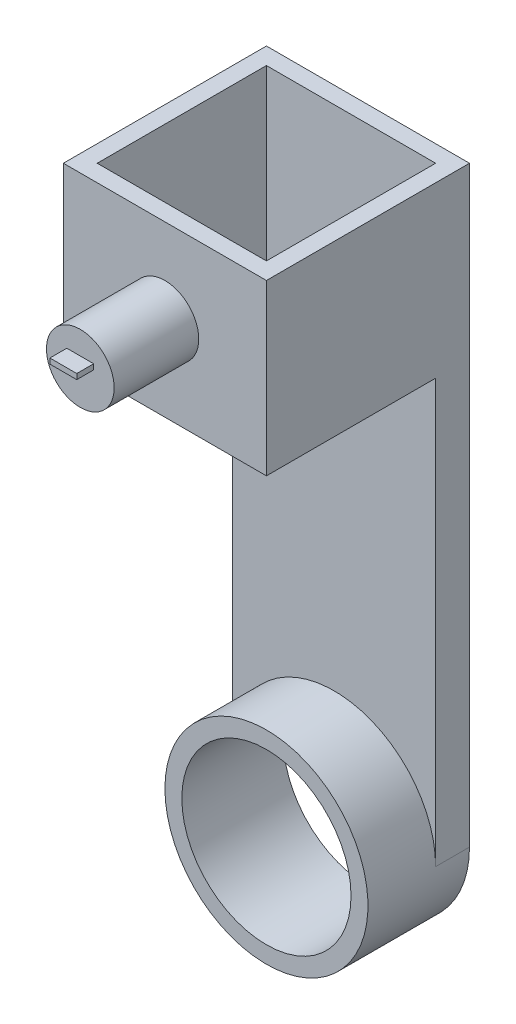
ISO-10303-21;
HEADER;
FILE_DESCRIPTION(('STEP AP214'),'2;1');
FILE_NAME('part.step','',(''),(''),'','','');
FILE_SCHEMA(('AUTOMOTIVE_DESIGN { 1 0 10303 214 1 1 1 1 }'));
ENDSEC;
DATA;
#1=APPLICATION_CONTEXT('core data for automotive mechanical design processes');
#2=APPLICATION_PROTOCOL_DEFINITION('international standard','automotive_design',2000,#1);
#3=PRODUCT_CONTEXT('',#1,'mechanical');
#4=PRODUCT('Part','Part','',(#3));
#5=PRODUCT_RELATED_PRODUCT_CATEGORY('part','',(#4));
#6=PRODUCT_DEFINITION_FORMATION('','',#4);
#7=PRODUCT_DEFINITION_CONTEXT('part definition',#1,'design');
#8=PRODUCT_DEFINITION('design','',#6,#7);
#9=PRODUCT_DEFINITION_SHAPE('','',#8);
#10=(LENGTH_UNIT() NAMED_UNIT(*) SI_UNIT(.MILLI.,.METRE.));
#11=(NAMED_UNIT(*) PLANE_ANGLE_UNIT() SI_UNIT($,.RADIAN.));
#12=(NAMED_UNIT(*) SI_UNIT($,.STERADIAN.) SOLID_ANGLE_UNIT());
#13=UNCERTAINTY_MEASURE_WITH_UNIT(LENGTH_MEASURE(1.E-05),#10,'distance_accuracy_value','');
#14=(GEOMETRIC_REPRESENTATION_CONTEXT(3) GLOBAL_UNCERTAINTY_ASSIGNED_CONTEXT((#13)) GLOBAL_UNIT_ASSIGNED_CONTEXT((#10,
#11,#12)) REPRESENTATION_CONTEXT('',''));
#15=CARTESIAN_POINT('',(0.,0.,0.));
#16=DIRECTION('',(0.,0.,1.));
#17=DIRECTION('',(1.,0.,0.));
#18=AXIS2_PLACEMENT_3D('',#15,#16,#17);
#19=CARTESIAN_POINT('',(0.,0.,17.));
#20=DIRECTION('',(0.,0.,1.));
#21=DIRECTION('',(1.,0.,0.));
#22=AXIS2_PLACEMENT_3D('',#19,#20,#21);
#23=PLANE('',#22);
#24=CARTESIAN_POINT('',(0.,30.,17.));
#25=DIRECTION('',(0.,0.,1.));
#26=DIRECTION('',(1.,0.,0.));
#27=AXIS2_PLACEMENT_3D('',#24,#25,#26);
#28=CIRCLE('',#27,2.);
#29=CARTESIAN_POINT('',(2.,30.,17.));
#30=VERTEX_POINT('',#29);
#31=EDGE_CURVE('E175',#30,#30,#28,.T.);
#32=ORIENTED_EDGE('',*,*,#31,.T.);
#33=EDGE_LOOP('',(#32));
#34=FACE_BOUND('',#33,.T.);
#35=DIRECTION('',(1.,0.,0.));
#36=VECTOR('',#35,1.);
#37=CARTESIAN_POINT('',(-0.797202197602834,30.3196897595803,17.));
#38=LINE('',#37,#36);
#39=CARTESIAN_POINT('',(-0.797202197602834,30.3196897595803,17.));
#40=VERTEX_POINT('',#39);
#41=CARTESIAN_POINT('',(0.791315647143659,30.3196897595803,17.));
#42=VERTEX_POINT('',#41);
#43=EDGE_CURVE('E464',#40,#42,#38,.T.);
#44=ORIENTED_EDGE('',*,*,#43,.F.);
#45=DIRECTION('',(0.,-1.,0.));
#46=VECTOR('',#45,1.);
#47=CARTESIAN_POINT('',(-0.797202197602834,30.6335435420232,17.));
#48=LINE('',#47,#46);
#49=CARTESIAN_POINT('',(-0.797202197602834,30.6335435420232,17.));
#50=VERTEX_POINT('',#49);
#51=EDGE_CURVE('E173',#50,#40,#48,.T.);
#52=ORIENTED_EDGE('',*,*,#51,.F.);
#53=DIRECTION('',(-1.,0.,0.));
#54=VECTOR('',#53,1.);
#55=CARTESIAN_POINT('',(-0.797202197602834,30.6335435420232,17.));
#56=LINE('',#55,#54);
#57=CARTESIAN_POINT('',(0.791315647143659,30.6335435420232,17.));
#58=VERTEX_POINT('',#57);
#59=EDGE_CURVE('E169',#58,#50,#56,.T.);
#60=ORIENTED_EDGE('',*,*,#59,.F.);
#61=DIRECTION('',(0.,1.,0.));
#62=VECTOR('',#61,1.);
#63=CARTESIAN_POINT('',(0.791315647143659,30.3196897595803,17.));
#64=LINE('',#63,#62);
#65=EDGE_CURVE('E461',#42,#58,#64,.T.);
#66=ORIENTED_EDGE('',*,*,#65,.F.);
#67=EDGE_LOOP('',(#44,#52,#60,#66));
#68=FACE_BOUND('',#67,.T.);
#69=ADVANCED_FACE('F41',(#34,#68),#23,.T.);
#70=CARTESIAN_POINT('',(0.,35.,0.));
#71=DIRECTION('',(0.,1.,0.));
#72=DIRECTION('',(0.,0.,1.));
#73=AXIS2_PLACEMENT_3D('',#70,#71,#72);
#74=PLANE('',#73);
#75=DIRECTION('',(0.,0.,1.));
#76=VECTOR('',#75,1.);
#77=CARTESIAN_POINT('',(-6.,35.,0.));
#78=LINE('',#77,#76);
#79=CARTESIAN_POINT('',(-6.,35.,0.));
#80=VERTEX_POINT('',#79);
#81=CARTESIAN_POINT('',(-6.,35.,12.));
#82=VERTEX_POINT('',#81);
#83=EDGE_CURVE('E215',#80,#82,#78,.T.);
#84=ORIENTED_EDGE('',*,*,#83,.T.);
#85=DIRECTION('',(1.,0.,0.));
#86=VECTOR('',#85,1.);
#87=CARTESIAN_POINT('',(-6.,35.,12.));
#88=LINE('',#87,#86);
#89=CARTESIAN_POINT('',(6.,35.,12.));
#90=VERTEX_POINT('',#89);
#91=EDGE_CURVE('E218',#82,#90,#88,.T.);
#92=ORIENTED_EDGE('',*,*,#91,.T.);
#93=DIRECTION('',(0.,0.,-1.));
#94=VECTOR('',#93,1.);
#95=CARTESIAN_POINT('',(6.,35.,0.));
#96=LINE('',#95,#94);
#97=CARTESIAN_POINT('',(6.,35.,0.));
#98=VERTEX_POINT('',#97);
#99=EDGE_CURVE('E221',#90,#98,#96,.T.);
#100=ORIENTED_EDGE('',*,*,#99,.T.);
#101=DIRECTION('',(-1.,0.,0.));
#102=VECTOR('',#101,1.);
#103=CARTESIAN_POINT('',(-6.,35.,0.));
#104=LINE('',#103,#102);
#105=EDGE_CURVE('E224',#98,#80,#104,.T.);
#106=ORIENTED_EDGE('',*,*,#105,.T.);
#107=EDGE_LOOP('',(#84,#92,#100,#106));
#108=FACE_BOUND('',#107,.T.);
#109=DIRECTION('',(0.,0.,-1.));
#110=VECTOR('',#109,1.);
#111=CARTESIAN_POINT('',(-5.00000000000002,35.,0.));
#112=LINE('',#111,#110);
#113=CARTESIAN_POINT('',(-5.00000000000002,35.,11.));
#114=VERTEX_POINT('',#113);
#115=CARTESIAN_POINT('',(-5.00000000000002,35.,0.999999999999982));
#116=VERTEX_POINT('',#115);
#117=EDGE_CURVE('E199',#114,#116,#112,.T.);
#118=ORIENTED_EDGE('',*,*,#117,.T.);
#119=DIRECTION('',(1.,0.,0.));
#120=VECTOR('',#119,1.);
#121=CARTESIAN_POINT('',(0.,35.,0.999999999999999));
#122=LINE('',#121,#120);
#123=CARTESIAN_POINT('',(5.00000000000002,35.,0.999999999999999));
#124=VERTEX_POINT('',#123);
#125=EDGE_CURVE('E65',#116,#124,#122,.T.);
#126=ORIENTED_EDGE('',*,*,#125,.T.);
#127=DIRECTION('',(0.,0.,-1.));
#128=VECTOR('',#127,1.);
#129=CARTESIAN_POINT('',(5.00000000000002,35.,0.));
#130=LINE('',#129,#128);
#131=CARTESIAN_POINT('',(5.,35.,11.));
#132=VERTEX_POINT('',#131);
#133=EDGE_CURVE('E186',#132,#124,#130,.T.);
#134=ORIENTED_EDGE('',*,*,#133,.F.);
#135=DIRECTION('',(1.,0.,0.));
#136=VECTOR('',#135,1.);
#137=CARTESIAN_POINT('',(0.,35.,11.));
#138=LINE('',#137,#136);
#139=EDGE_CURVE('E202',#114,#132,#138,.T.);
#140=ORIENTED_EDGE('',*,*,#139,.F.);
#141=EDGE_LOOP('',(#118,#126,#134,#140));
#142=FACE_BOUND('',#141,.T.);
#143=ADVANCED_FACE('F282',(#108,#142),#74,.T.);
#144=CARTESIAN_POINT('',(6.,0.,2.));
#145=DIRECTION('',(-1.,0.,0.));
#146=DIRECTION('',(0.,-1.,0.));
#147=AXIS2_PLACEMENT_3D('',#144,#145,#146);
#148=PLANE('',#147);
#149=DIRECTION('',(0.,1.,0.));
#150=VECTOR('',#149,1.);
#151=CARTESIAN_POINT('',(6.,0.,0.));
#152=LINE('',#151,#150);
#153=CARTESIAN_POINT('',(6.,0.,0.));
#154=VERTEX_POINT('',#153);
#155=EDGE_CURVE('E248',#154,#98,#152,.T.);
#156=ORIENTED_EDGE('',*,*,#155,.T.);
#157=ORIENTED_EDGE('',*,*,#99,.F.);
#158=DIRECTION('',(0.,-1.,0.));
#159=VECTOR('',#158,1.);
#160=CARTESIAN_POINT('',(6.,35.,12.));
#161=LINE('',#160,#159);
#162=CARTESIAN_POINT('',(6.,25.,12.));
#163=VERTEX_POINT('',#162);
#164=EDGE_CURVE('E227',#90,#163,#161,.T.);
#165=ORIENTED_EDGE('',*,*,#164,.T.);
#166=DIRECTION('',(0.,0.,-1.));
#167=VECTOR('',#166,1.);
#168=CARTESIAN_POINT('',(6.,25.,0.));
#169=LINE('',#168,#167);
#170=CARTESIAN_POINT('',(6.,25.,2.));
#171=VERTEX_POINT('',#170);
#172=EDGE_CURVE('E219',#163,#171,#169,.T.);
#173=ORIENTED_EDGE('',*,*,#172,.T.);
#174=DIRECTION('',(0.,1.,0.));
#175=VECTOR('',#174,1.);
#176=CARTESIAN_POINT('',(6.,0.,2.));
#177=LINE('',#176,#175);
#178=CARTESIAN_POINT('',(6.,0.,2.));
#179=VERTEX_POINT('',#178);
#180=EDGE_CURVE('E252',#179,#171,#177,.T.);
#181=ORIENTED_EDGE('',*,*,#180,.F.);
#182=DIRECTION('',(0.,0.,-1.));
#183=VECTOR('',#182,1.);
#184=CARTESIAN_POINT('',(6.,0.,2.));
#185=LINE('',#184,#183);
#186=EDGE_CURVE('E45',#179,#154,#185,.T.);
#187=ORIENTED_EDGE('',*,*,#186,.T.);
#188=EDGE_LOOP('',(#156,#157,#165,#173,#181,#187));
#189=FACE_BOUND('',#188,.T.);
#190=ADVANCED_FACE('F43',(#189),#148,.F.);
#191=CARTESIAN_POINT('',(-6.,0.,2.));
#192=DIRECTION('',(1.,0.,0.));
#193=DIRECTION('',(0.,1.,0.));
#194=AXIS2_PLACEMENT_3D('',#191,#192,#193);
#195=PLANE('',#194);
#196=DIRECTION('',(0.,-1.,0.));
#197=VECTOR('',#196,1.);
#198=CARTESIAN_POINT('',(-6.,0.,0.));
#199=LINE('',#198,#197);
#200=CARTESIAN_POINT('',(-6.,0.,0.));
#201=VERTEX_POINT('',#200);
#202=EDGE_CURVE('E253',#80,#201,#199,.T.);
#203=ORIENTED_EDGE('',*,*,#202,.T.);
#204=DIRECTION('',(0.,0.,-1.));
#205=VECTOR('',#204,1.);
#206=CARTESIAN_POINT('',(-6.,0.,2.));
#207=LINE('',#206,#205);
#208=CARTESIAN_POINT('',(-6.,0.,2.));
#209=VERTEX_POINT('',#208);
#210=EDGE_CURVE('E264',#209,#201,#207,.T.);
#211=ORIENTED_EDGE('',*,*,#210,.F.);
#212=DIRECTION('',(0.,-1.,0.));
#213=VECTOR('',#212,1.);
#214=CARTESIAN_POINT('',(-6.,0.,2.));
#215=LINE('',#214,#213);
#216=CARTESIAN_POINT('',(-6.,25.,2.));
#217=VERTEX_POINT('',#216);
#218=EDGE_CURVE('E260',#217,#209,#215,.T.);
#219=ORIENTED_EDGE('',*,*,#218,.F.);
#220=DIRECTION('',(0.,0.,1.));
#221=VECTOR('',#220,1.);
#222=CARTESIAN_POINT('',(-6.,25.,0.));
#223=LINE('',#222,#221);
#224=CARTESIAN_POINT('',(-6.,25.,12.));
#225=VERTEX_POINT('',#224);
#226=EDGE_CURVE('E209',#217,#225,#223,.T.);
#227=ORIENTED_EDGE('',*,*,#226,.T.);
#228=DIRECTION('',(0.,-1.,0.));
#229=VECTOR('',#228,1.);
#230=CARTESIAN_POINT('',(-6.,35.,12.));
#231=LINE('',#230,#229);
#232=EDGE_CURVE('E235',#82,#225,#231,.T.);
#233=ORIENTED_EDGE('',*,*,#232,.F.);
#234=ORIENTED_EDGE('',*,*,#83,.F.);
#235=EDGE_LOOP('',(#203,#211,#219,#227,#233,#234));
#236=FACE_BOUND('',#235,.T.);
#237=ADVANCED_FACE('F286',(#236),#195,.F.);
#238=CARTESIAN_POINT('',(0.,0.,2.));
#239=DIRECTION('',(0.,0.,1.));
#240=DIRECTION('',(1.,0.,0.));
#241=AXIS2_PLACEMENT_3D('',#238,#239,#240);
#242=PLANE('',#241);
#243=CARTESIAN_POINT('',(0.,0.,2.));
#244=DIRECTION('',(0.,0.,1.));
#245=DIRECTION('',(1.,0.,0.));
#246=AXIS2_PLACEMENT_3D('',#243,#244,#245);
#247=CIRCLE('',#246,6.);
#248=EDGE_CURVE('E250',#179,#209,#247,.T.);
#249=ORIENTED_EDGE('',*,*,#248,.F.);
#250=ORIENTED_EDGE('',*,*,#180,.T.);
#251=DIRECTION('',(-1.,0.,0.));
#252=VECTOR('',#251,1.);
#253=CARTESIAN_POINT('',(0.,25.,2.));
#254=LINE('',#253,#252);
#255=CARTESIAN_POINT('',(5.00000000000002,25.,2.));
#256=VERTEX_POINT('',#255);
#257=EDGE_CURVE('E257',#171,#256,#254,.T.);
#258=ORIENTED_EDGE('',*,*,#257,.T.);
#259=CARTESIAN_POINT('',(-5.00000000000002,25.,2.));
#260=VERTEX_POINT('',#259);
#261=EDGE_CURVE('E261',#256,#260,#254,.T.);
#262=ORIENTED_EDGE('',*,*,#261,.T.);
#263=EDGE_CURVE('E256',#260,#217,#254,.T.);
#264=ORIENTED_EDGE('',*,*,#263,.T.);
#265=ORIENTED_EDGE('',*,*,#218,.T.);
#266=EDGE_LOOP('',(#249,#250,#258,#262,#264,#265));
#267=FACE_BOUND('',#266,.T.);
#268=ADVANCED_FACE('F299',(#267),#242,.T.);
#269=CARTESIAN_POINT('',(0.,0.,0.));
#270=DIRECTION('',(0.,0.,1.));
#271=DIRECTION('',(1.,0.,0.));
#272=AXIS2_PLACEMENT_3D('',#269,#270,#271);
#273=PLANE('',#272);
#274=ORIENTED_EDGE('',*,*,#155,.F.);
#275=CARTESIAN_POINT('',(0.,0.,0.));
#276=DIRECTION('',(0.,0.,-1.));
#277=DIRECTION('',(-1.,0.,0.));
#278=AXIS2_PLACEMENT_3D('',#275,#276,#277);
#279=CIRCLE('',#278,6.);
#280=EDGE_CURVE('E242',#154,#201,#279,.T.);
#281=ORIENTED_EDGE('',*,*,#280,.T.);
#282=ORIENTED_EDGE('',*,*,#202,.F.);
#283=ORIENTED_EDGE('',*,*,#105,.F.);
#284=EDGE_LOOP('',(#274,#281,#282,#283));
#285=FACE_BOUND('',#284,.T.);
#286=CARTESIAN_POINT('',(0.,0.,0.));
#287=DIRECTION('',(0.,0.,-1.));
#288=DIRECTION('',(-1.,0.,0.));
#289=AXIS2_PLACEMENT_3D('',#286,#287,#288);
#290=CIRCLE('',#289,5.);
#291=CARTESIAN_POINT('',(-5.,0.,0.));
#292=VERTEX_POINT('',#291);
#293=EDGE_CURVE('E238',#292,#292,#290,.T.);
#294=ORIENTED_EDGE('',*,*,#293,.F.);
#295=EDGE_LOOP('',(#294));
#296=FACE_BOUND('',#295,.T.);
#297=ADVANCED_FACE('F278',(#285,#296),#273,.F.);
#298=CARTESIAN_POINT('',(0.,0.,6.));
#299=DIRECTION('',(0.,0.,-1.));
#300=DIRECTION('',(-1.,0.,0.));
#301=AXIS2_PLACEMENT_3D('',#298,#299,#300);
#302=CYLINDRICAL_SURFACE('',#301,6.);
#303=CARTESIAN_POINT('',(0.,0.,6.));
#304=DIRECTION('',(0.,0.,-1.));
#305=DIRECTION('',(-1.,0.,0.));
#306=AXIS2_PLACEMENT_3D('',#303,#304,#305);
#307=CIRCLE('',#306,6.);
#308=CARTESIAN_POINT('',(-6.,0.,6.));
#309=VERTEX_POINT('',#308);
#310=EDGE_CURVE('E245',#309,#309,#307,.T.);
#311=ORIENTED_EDGE('',*,*,#310,.T.);
#312=EDGE_LOOP('',(#311));
#313=FACE_BOUND('',#312,.T.);
#314=ORIENTED_EDGE('',*,*,#186,.F.);
#315=ORIENTED_EDGE('',*,*,#248,.T.);
#316=ORIENTED_EDGE('',*,*,#210,.T.);
#317=ORIENTED_EDGE('',*,*,#280,.F.);
#318=EDGE_LOOP('',(#314,#315,#316,#317));
#319=FACE_BOUND('',#318,.T.);
#320=ADVANCED_FACE('F300',(#313,#319),#302,.T.);
#321=CARTESIAN_POINT('',(0.,0.,6.));
#322=DIRECTION('',(0.,0.,-1.));
#323=DIRECTION('',(-1.,0.,0.));
#324=AXIS2_PLACEMENT_3D('',#321,#322,#323);
#325=PLANE('',#324);
#326=CARTESIAN_POINT('',(0.,0.,6.));
#327=DIRECTION('',(0.,0.,-1.));
#328=DIRECTION('',(-1.,0.,0.));
#329=AXIS2_PLACEMENT_3D('',#326,#327,#328);
#330=CIRCLE('',#329,5.);
#331=CARTESIAN_POINT('',(-5.,0.,6.));
#332=VERTEX_POINT('',#331);
#333=EDGE_CURVE('E239',#332,#332,#330,.T.);
#334=ORIENTED_EDGE('',*,*,#333,.T.);
#335=EDGE_LOOP('',(#334));
#336=FACE_BOUND('',#335,.T.);
#337=ORIENTED_EDGE('',*,*,#310,.F.);
#338=EDGE_LOOP('',(#337));
#339=FACE_BOUND('',#338,.T.);
#340=ADVANCED_FACE('F302',(#336,#339),#325,.F.);
#341=CARTESIAN_POINT('',(0.,0.,6.));
#342=DIRECTION('',(0.,0.,-1.));
#343=DIRECTION('',(-1.,0.,0.));
#344=AXIS2_PLACEMENT_3D('',#341,#342,#343);
#345=CYLINDRICAL_SURFACE('',#344,5.);
#346=ORIENTED_EDGE('',*,*,#333,.F.);
#347=EDGE_LOOP('',(#346));
#348=FACE_BOUND('',#347,.T.);
#349=ORIENTED_EDGE('',*,*,#293,.T.);
#350=EDGE_LOOP('',(#349));
#351=FACE_BOUND('',#350,.T.);
#352=ADVANCED_FACE('F309',(#348,#351),#345,.F.);
#353=CARTESIAN_POINT('',(-6.,35.,12.));
#354=DIRECTION('',(0.,0.,-1.));
#355=DIRECTION('',(-1.,0.,0.));
#356=AXIS2_PLACEMENT_3D('',#353,#354,#355);
#357=PLANE('',#356);
#358=CARTESIAN_POINT('',(0.,30.,12.));
#359=DIRECTION('',(0.,0.,1.));
#360=DIRECTION('',(1.,0.,0.));
#361=AXIS2_PLACEMENT_3D('',#358,#359,#360);
#362=CIRCLE('',#361,2.);
#363=CARTESIAN_POINT('',(2.,30.,12.));
#364=VERTEX_POINT('',#363);
#365=EDGE_CURVE('E11',#364,#364,#362,.T.);
#366=ORIENTED_EDGE('',*,*,#365,.F.);
#367=EDGE_LOOP('',(#366));
#368=FACE_BOUND('',#367,.T.);
#369=DIRECTION('',(1.,0.,0.));
#370=VECTOR('',#369,1.);
#371=CARTESIAN_POINT('',(-6.,25.,12.));
#372=LINE('',#371,#370);
#373=EDGE_CURVE('E229',#225,#163,#372,.T.);
#374=ORIENTED_EDGE('',*,*,#373,.T.);
#375=ORIENTED_EDGE('',*,*,#164,.F.);
#376=ORIENTED_EDGE('',*,*,#91,.F.);
#377=ORIENTED_EDGE('',*,*,#232,.T.);
#378=EDGE_LOOP('',(#374,#375,#376,#377));
#379=FACE_BOUND('',#378,.T.);
#380=ADVANCED_FACE('F291',(#368,#379),#357,.F.);
#381=CARTESIAN_POINT('',(0.,25.,0.));
#382=DIRECTION('',(0.,1.,0.));
#383=DIRECTION('',(0.,0.,1.));
#384=AXIS2_PLACEMENT_3D('',#381,#382,#383);
#385=PLANE('',#384);
#386=DIRECTION('',(1.,0.,0.));
#387=VECTOR('',#386,1.);
#388=CARTESIAN_POINT('',(0.,25.,11.));
#389=LINE('',#388,#387);
#390=CARTESIAN_POINT('',(-5.00000000000002,25.,11.));
#391=VERTEX_POINT('',#390);
#392=CARTESIAN_POINT('',(5.,25.,11.));
#393=VERTEX_POINT('',#392);
#394=EDGE_CURVE('E190',#391,#393,#389,.T.);
#395=ORIENTED_EDGE('',*,*,#394,.T.);
#396=DIRECTION('',(0.,0.,-1.));
#397=VECTOR('',#396,1.);
#398=CARTESIAN_POINT('',(5.00000000000002,25.,0.));
#399=LINE('',#398,#397);
#400=EDGE_CURVE('E194',#393,#256,#399,.T.);
#401=ORIENTED_EDGE('',*,*,#400,.T.);
#402=ORIENTED_EDGE('',*,*,#257,.F.);
#403=ORIENTED_EDGE('',*,*,#172,.F.);
#404=ORIENTED_EDGE('',*,*,#373,.F.);
#405=ORIENTED_EDGE('',*,*,#226,.F.);
#406=ORIENTED_EDGE('',*,*,#263,.F.);
#407=DIRECTION('',(0.,0.,-1.));
#408=VECTOR('',#407,1.);
#409=CARTESIAN_POINT('',(-5.00000000000002,25.,0.));
#410=LINE('',#409,#408);
#411=EDGE_CURVE('E187',#391,#260,#410,.T.);
#412=ORIENTED_EDGE('',*,*,#411,.F.);
#413=EDGE_LOOP('',(#395,#401,#402,#403,#404,#405,#406,#412));
#414=FACE_BOUND('',#413,.T.);
#415=ADVANCED_FACE('F295',(#414),#385,.F.);
#416=CARTESIAN_POINT('',(0.,25.,0.999999999999999));
#417=DIRECTION('',(0.,0.,1.));
#418=DIRECTION('',(1.,0.,0.));
#419=AXIS2_PLACEMENT_3D('',#416,#417,#418);
#420=PLANE('',#419);
#421=ORIENTED_EDGE('',*,*,#125,.F.);
#422=DIRECTION('',(0.,1.,0.));
#423=VECTOR('',#422,1.);
#424=CARTESIAN_POINT('',(-5.00000000000002,25.,0.999999999999982));
#425=LINE('',#424,#423);
#426=CARTESIAN_POINT('',(-5.00000000000002,25.,0.999999999999982));
#427=VERTEX_POINT('',#426);
#428=EDGE_CURVE('E197',#427,#116,#425,.T.);
#429=ORIENTED_EDGE('',*,*,#428,.F.);
#430=DIRECTION('',(1.,0.,0.));
#431=VECTOR('',#430,1.);
#432=CARTESIAN_POINT('',(0.,25.,0.999999999999999));
#433=LINE('',#432,#431);
#434=CARTESIAN_POINT('',(5.00000000000002,25.,0.999999999999999));
#435=VERTEX_POINT('',#434);
#436=EDGE_CURVE('E182',#427,#435,#433,.T.);
#437=ORIENTED_EDGE('',*,*,#436,.T.);
#438=DIRECTION('',(0.,1.,0.));
#439=VECTOR('',#438,1.);
#440=CARTESIAN_POINT('',(5.00000000000002,25.,0.999999999999999));
#441=LINE('',#440,#439);
#442=EDGE_CURVE('E207',#435,#124,#441,.T.);
#443=ORIENTED_EDGE('',*,*,#442,.T.);
#444=EDGE_LOOP('',(#421,#429,#437,#443));
#445=FACE_BOUND('',#444,.T.);
#446=ADVANCED_FACE('F338',(#445),#420,.T.);
#447=CARTESIAN_POINT('',(5.00000000000002,25.,0.));
#448=DIRECTION('',(1.,0.,0.));
#449=DIRECTION('',(0.,0.,-1.));
#450=AXIS2_PLACEMENT_3D('',#447,#448,#449);
#451=PLANE('',#450);
#452=ORIENTED_EDGE('',*,*,#133,.T.);
#453=ORIENTED_EDGE('',*,*,#442,.F.);
#454=EDGE_CURVE('E193',#256,#435,#399,.T.);
#455=ORIENTED_EDGE('',*,*,#454,.F.);
#456=ORIENTED_EDGE('',*,*,#400,.F.);
#457=DIRECTION('',(0.,1.,0.));
#458=VECTOR('',#457,1.);
#459=CARTESIAN_POINT('',(5.,25.,11.));
#460=LINE('',#459,#458);
#461=EDGE_CURVE('E210',#393,#132,#460,.T.);
#462=ORIENTED_EDGE('',*,*,#461,.T.);
#463=EDGE_LOOP('',(#452,#453,#455,#456,#462));
#464=FACE_BOUND('',#463,.T.);
#465=ADVANCED_FACE('F334',(#464),#451,.F.);
#466=CARTESIAN_POINT('',(0.,25.,11.));
#467=DIRECTION('',(0.,0.,1.));
#468=DIRECTION('',(1.,0.,0.));
#469=AXIS2_PLACEMENT_3D('',#466,#467,#468);
#470=PLANE('',#469);
#471=ORIENTED_EDGE('',*,*,#139,.T.);
#472=ORIENTED_EDGE('',*,*,#461,.F.);
#473=ORIENTED_EDGE('',*,*,#394,.F.);
#474=DIRECTION('',(0.,1.,0.));
#475=VECTOR('',#474,1.);
#476=CARTESIAN_POINT('',(-5.00000000000002,25.,11.));
#477=LINE('',#476,#475);
#478=EDGE_CURVE('E212',#391,#114,#477,.T.);
#479=ORIENTED_EDGE('',*,*,#478,.T.);
#480=EDGE_LOOP('',(#471,#472,#473,#479));
#481=FACE_BOUND('',#480,.T.);
#482=ADVANCED_FACE('F337',(#481),#470,.F.);
#483=CARTESIAN_POINT('',(-5.00000000000002,25.,0.));
#484=DIRECTION('',(1.,0.,0.));
#485=DIRECTION('',(0.,0.,-1.));
#486=AXIS2_PLACEMENT_3D('',#483,#484,#485);
#487=PLANE('',#486);
#488=ORIENTED_EDGE('',*,*,#117,.F.);
#489=ORIENTED_EDGE('',*,*,#478,.F.);
#490=ORIENTED_EDGE('',*,*,#411,.T.);
#491=EDGE_CURVE('E185',#260,#427,#410,.T.);
#492=ORIENTED_EDGE('',*,*,#491,.T.);
#493=ORIENTED_EDGE('',*,*,#428,.T.);
#494=EDGE_LOOP('',(#488,#489,#490,#492,#493));
#495=FACE_BOUND('',#494,.T.);
#496=ADVANCED_FACE('F332',(#495),#487,.T.);
#497=CARTESIAN_POINT('',(0.,25.,0.));
#498=DIRECTION('',(0.,1.,0.));
#499=DIRECTION('',(0.,0.,1.));
#500=AXIS2_PLACEMENT_3D('',#497,#498,#499);
#501=PLANE('',#500);
#502=ORIENTED_EDGE('',*,*,#454,.T.);
#503=ORIENTED_EDGE('',*,*,#436,.F.);
#504=ORIENTED_EDGE('',*,*,#491,.F.);
#505=ORIENTED_EDGE('',*,*,#261,.F.);
#506=EDGE_LOOP('',(#502,#503,#504,#505));
#507=FACE_BOUND('',#506,.T.);
#508=ADVANCED_FACE('F329',(#507),#501,.T.);
#509=CARTESIAN_POINT('',(0.,30.,17.));
#510=DIRECTION('',(0.,0.,-1.));
#511=DIRECTION('',(-1.,0.,0.));
#512=AXIS2_PLACEMENT_3D('',#509,#510,#511);
#513=CYLINDRICAL_SURFACE('',#512,2.);
#514=ORIENTED_EDGE('',*,*,#31,.F.);
#515=EDGE_LOOP('',(#514));
#516=FACE_BOUND('',#515,.T.);
#517=ORIENTED_EDGE('',*,*,#365,.T.);
#518=EDGE_LOOP('',(#517));
#519=FACE_BOUND('',#518,.T.);
#520=ADVANCED_FACE('F327',(#516,#519),#513,.T.);
#521=CARTESIAN_POINT('',(-0.797202197602834,30.6335435420232,18.));
#522=DIRECTION('',(1.,0.,0.));
#523=DIRECTION('',(0.,0.,-1.));
#524=AXIS2_PLACEMENT_3D('',#521,#522,#523);
#525=PLANE('',#524);
#526=ORIENTED_EDGE('',*,*,#51,.T.);
#527=DIRECTION('',(0.,0.,-1.));
#528=VECTOR('',#527,1.);
#529=CARTESIAN_POINT('',(-0.797202197602834,30.3196897595803,18.));
#530=LINE('',#529,#528);
#531=CARTESIAN_POINT('',(-0.797202197602834,30.3196897595803,18.));
#532=VERTEX_POINT('',#531);
#533=EDGE_CURVE('E154',#532,#40,#530,.T.);
#534=ORIENTED_EDGE('',*,*,#533,.F.);
#535=DIRECTION('',(0.,-1.,0.));
#536=VECTOR('',#535,1.);
#537=CARTESIAN_POINT('',(-0.797202197602834,30.6335435420232,18.));
#538=LINE('',#537,#536);
#539=CARTESIAN_POINT('',(-0.797202197602834,30.6335435420232,18.));
#540=VERTEX_POINT('',#539);
#541=EDGE_CURVE('E161',#540,#532,#538,.T.);
#542=ORIENTED_EDGE('',*,*,#541,.F.);
#543=DIRECTION('',(0.,0.,-1.));
#544=VECTOR('',#543,1.);
#545=CARTESIAN_POINT('',(-0.797202197602834,30.6335435420232,18.));
#546=LINE('',#545,#544);
#547=EDGE_CURVE('E459',#540,#50,#546,.T.);
#548=ORIENTED_EDGE('',*,*,#547,.T.);
#549=EDGE_LOOP('',(#526,#534,#542,#548));
#550=FACE_BOUND('',#549,.T.);
#551=ADVANCED_FACE('F171',(#550),#525,.F.);
#552=CARTESIAN_POINT('',(-0.797202197602834,30.3196897595803,18.));
#553=DIRECTION('',(0.,1.,0.));
#554=DIRECTION('',(0.,0.,1.));
#555=AXIS2_PLACEMENT_3D('',#552,#553,#554);
#556=PLANE('',#555);
#557=ORIENTED_EDGE('',*,*,#43,.T.);
#558=DIRECTION('',(0.,0.,-1.));
#559=VECTOR('',#558,1.);
#560=CARTESIAN_POINT('',(0.791315647143659,30.3196897595803,18.));
#561=LINE('',#560,#559);
#562=CARTESIAN_POINT('',(0.791315647143659,30.3196897595803,18.));
#563=VERTEX_POINT('',#562);
#564=EDGE_CURVE('E157',#563,#42,#561,.T.);
#565=ORIENTED_EDGE('',*,*,#564,.F.);
#566=DIRECTION('',(1.,0.,0.));
#567=VECTOR('',#566,1.);
#568=CARTESIAN_POINT('',(-0.797202197602834,30.3196897595803,18.));
#569=LINE('',#568,#567);
#570=EDGE_CURVE('E150',#532,#563,#569,.T.);
#571=ORIENTED_EDGE('',*,*,#570,.F.);
#572=ORIENTED_EDGE('',*,*,#533,.T.);
#573=EDGE_LOOP('',(#557,#565,#571,#572));
#574=FACE_BOUND('',#573,.T.);
#575=ADVANCED_FACE('F152',(#574),#556,.F.);
#576=CARTESIAN_POINT('',(0.791315647143659,30.3196897595803,18.));
#577=DIRECTION('',(-1.,0.,0.));
#578=DIRECTION('',(0.,0.,1.));
#579=AXIS2_PLACEMENT_3D('',#576,#577,#578);
#580=PLANE('',#579);
#581=ORIENTED_EDGE('',*,*,#65,.T.);
#582=DIRECTION('',(0.,0.,-1.));
#583=VECTOR('',#582,1.);
#584=CARTESIAN_POINT('',(0.791315647143659,30.6335435420232,18.));
#585=LINE('',#584,#583);
#586=CARTESIAN_POINT('',(0.791315647143659,30.6335435420232,18.));
#587=VERTEX_POINT('',#586);
#588=EDGE_CURVE('E57',#587,#58,#585,.T.);
#589=ORIENTED_EDGE('',*,*,#588,.F.);
#590=DIRECTION('',(0.,1.,0.));
#591=VECTOR('',#590,1.);
#592=CARTESIAN_POINT('',(0.791315647143659,30.3196897595803,18.));
#593=LINE('',#592,#591);
#594=EDGE_CURVE('E160',#563,#587,#593,.T.);
#595=ORIENTED_EDGE('',*,*,#594,.F.);
#596=ORIENTED_EDGE('',*,*,#564,.T.);
#597=EDGE_LOOP('',(#581,#589,#595,#596));
#598=FACE_BOUND('',#597,.T.);
#599=ADVANCED_FACE('F428',(#598),#580,.F.);
#600=CARTESIAN_POINT('',(-0.797202197602834,30.6335435420232,18.));
#601=DIRECTION('',(0.,-1.,0.));
#602=DIRECTION('',(0.,0.,-1.));
#603=AXIS2_PLACEMENT_3D('',#600,#601,#602);
#604=PLANE('',#603);
#605=ORIENTED_EDGE('',*,*,#59,.T.);
#606=ORIENTED_EDGE('',*,*,#547,.F.);
#607=DIRECTION('',(-1.,0.,0.));
#608=VECTOR('',#607,1.);
#609=CARTESIAN_POINT('',(-0.797202197602834,30.6335435420232,18.));
#610=LINE('',#609,#608);
#611=EDGE_CURVE('E165',#587,#540,#610,.T.);
#612=ORIENTED_EDGE('',*,*,#611,.F.);
#613=ORIENTED_EDGE('',*,*,#588,.T.);
#614=EDGE_LOOP('',(#605,#606,#612,#613));
#615=FACE_BOUND('',#614,.T.);
#616=ADVANCED_FACE('F435',(#615),#604,.F.);
#617=CARTESIAN_POINT('',(0.,0.,18.));
#618=DIRECTION('',(0.,0.,1.));
#619=DIRECTION('',(1.,0.,0.));
#620=AXIS2_PLACEMENT_3D('',#617,#618,#619);
#621=PLANE('',#620);
#622=ORIENTED_EDGE('',*,*,#541,.T.);
#623=ORIENTED_EDGE('',*,*,#570,.T.);
#624=ORIENTED_EDGE('',*,*,#594,.T.);
#625=ORIENTED_EDGE('',*,*,#611,.T.);
#626=EDGE_LOOP('',(#622,#623,#624,#625));
#627=FACE_BOUND('',#626,.T.);
#628=ADVANCED_FACE('F164',(#627),#621,.T.);
#629=CLOSED_SHELL('',(#69,#143,#190,#237,#268,#297,#320,#340,#352,#380,#415,#446,#465,#482,#496,
#508,#520,#551,#575,#599,#616,#628));
#630=MANIFOLD_SOLID_BREP('B2',#629);
#631=ADVANCED_BREP_SHAPE_REPRESENTATION('',(#18,#630),#14);
#632=SHAPE_DEFINITION_REPRESENTATION(#9,#631);
ENDSEC;
END-ISO-10303-21;
